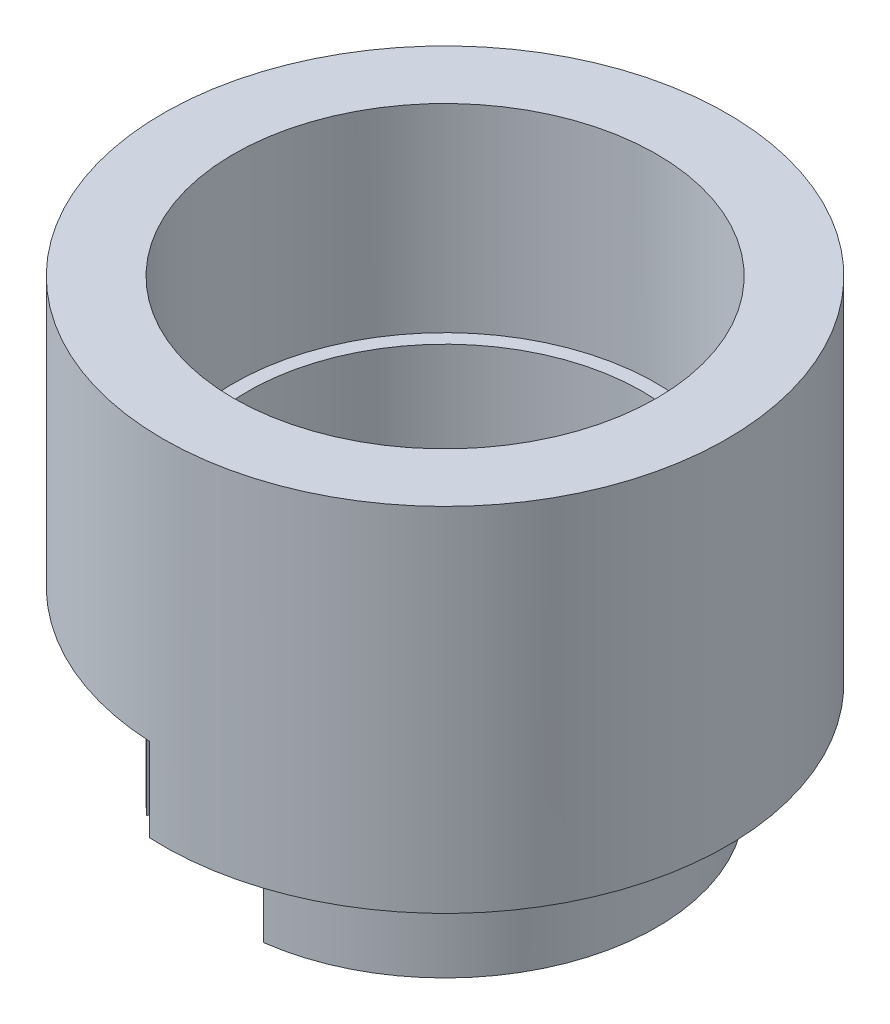
ISO-10303-21;
HEADER;
FILE_DESCRIPTION(('STEP AP214'),'2;1');
FILE_NAME('part.step','',(''),(''),'','','');
FILE_SCHEMA(('AUTOMOTIVE_DESIGN { 1 0 10303 214 1 1 1 1 }'));
ENDSEC;
DATA;
#1=APPLICATION_CONTEXT('core data for automotive mechanical design processes');
#2=APPLICATION_PROTOCOL_DEFINITION('international standard','automotive_design',2000,#1);
#3=PRODUCT_CONTEXT('',#1,'mechanical');
#4=PRODUCT('Part','Part','',(#3));
#5=PRODUCT_RELATED_PRODUCT_CATEGORY('part','',(#4));
#6=PRODUCT_DEFINITION_FORMATION('','',#4);
#7=PRODUCT_DEFINITION_CONTEXT('part definition',#1,'design');
#8=PRODUCT_DEFINITION('design','',#6,#7);
#9=PRODUCT_DEFINITION_SHAPE('','',#8);
#10=(LENGTH_UNIT() NAMED_UNIT(*) SI_UNIT(.MILLI.,.METRE.));
#11=(NAMED_UNIT(*) PLANE_ANGLE_UNIT() SI_UNIT($,.RADIAN.));
#12=(NAMED_UNIT(*) SI_UNIT($,.STERADIAN.) SOLID_ANGLE_UNIT());
#13=UNCERTAINTY_MEASURE_WITH_UNIT(LENGTH_MEASURE(1.E-05),#10,'distance_accuracy_value','');
#14=(GEOMETRIC_REPRESENTATION_CONTEXT(3) GLOBAL_UNCERTAINTY_ASSIGNED_CONTEXT((#13)) GLOBAL_UNIT_ASSIGNED_CONTEXT((#10,
#11,#12)) REPRESENTATION_CONTEXT('',''));
#15=CARTESIAN_POINT('',(0.,0.,0.));
#16=DIRECTION('',(0.,0.,1.));
#17=DIRECTION('',(1.,0.,0.));
#18=AXIS2_PLACEMENT_3D('',#15,#16,#17);
#19=CARTESIAN_POINT('',(0.,0.,0.));
#20=DIRECTION('',(0.,1.,0.));
#21=DIRECTION('',(0.,0.,1.));
#22=AXIS2_PLACEMENT_3D('',#19,#20,#21);
#23=PLANE('',#22);
#24=CARTESIAN_POINT('',(-21.1602690825293,0.,-29.1246117974979));
#25=DIRECTION('',(0.,-1.,0.));
#26=DIRECTION('',(0.,0.,-1.));
#27=AXIS2_PLACEMENT_3D('',#24,#25,#26);
#28=CIRCLE('',#27,1.5);
#29=CARTESIAN_POINT('',(-21.1602690825293,0.,-30.6246117974979));
#30=VERTEX_POINT('',#29);
#31=EDGE_CURVE('E253',#30,#30,#28,.T.);
#32=ORIENTED_EDGE('',*,*,#31,.F.);
#33=EDGE_LOOP('',(#32));
#34=FACE_BOUND('',#33,.T.);
#35=CARTESIAN_POINT('',(-34.2380345866256,0.,-11.1246117974978));
#36=DIRECTION('',(0.,-1.,0.));
#37=DIRECTION('',(0.,0.,-1.));
#38=AXIS2_PLACEMENT_3D('',#35,#36,#37);
#39=CIRCLE('',#38,1.5);
#40=CARTESIAN_POINT('',(-34.2380345866256,0.,-12.6246117974978));
#41=VERTEX_POINT('',#40);
#42=EDGE_CURVE('E236',#41,#41,#39,.T.);
#43=ORIENTED_EDGE('',*,*,#42,.F.);
#44=EDGE_LOOP('',(#43));
#45=FACE_BOUND('',#44,.T.);
#46=CARTESIAN_POINT('',(-34.2380345866254,0.,11.1246117974985));
#47=DIRECTION('',(0.,-1.,0.));
#48=DIRECTION('',(0.,0.,-1.));
#49=AXIS2_PLACEMENT_3D('',#46,#47,#48);
#50=CIRCLE('',#49,1.5);
#51=CARTESIAN_POINT('',(-34.2380345866254,0.,9.62461179749849));
#52=VERTEX_POINT('',#51);
#53=EDGE_CURVE('E207',#52,#52,#50,.T.);
#54=ORIENTED_EDGE('',*,*,#53,.F.);
#55=EDGE_LOOP('',(#54));
#56=FACE_BOUND('',#55,.T.);
#57=DIRECTION('',(-0.819178042205052,0.,0.573539305688021));
#58=VECTOR('',#57,1.);
#59=CARTESIAN_POINT('',(-3.81627640035369,0.,-5.45073336587605));
#60=LINE('',#59,#58);
#61=CARTESIAN_POINT('',(-30.2939246678071,0.,13.0873270082637));
#62=VERTEX_POINT('',#61);
#63=CARTESIAN_POINT('',(-36.126859333869,0.,17.1711978228324));
#64=VERTEX_POINT('',#63);
#65=EDGE_CURVE('E172',#62,#64,#60,.T.);
#66=ORIENTED_EDGE('',*,*,#65,.T.);
#67=CARTESIAN_POINT('',(0.,0.,0.));
#68=DIRECTION('',(0.,1.,0.));
#69=DIRECTION('',(0.,0.,1.));
#70=AXIS2_PLACEMENT_3D('',#67,#68,#69);
#71=CIRCLE('',#70,40.);
#72=CARTESIAN_POINT('',(-19.5058879135128,0.,-34.9216313580204));
#73=VERTEX_POINT('',#72);
#74=EDGE_CURVE('E42',#73,#64,#71,.T.);
#75=ORIENTED_EDGE('',*,*,#74,.F.);
#76=DIRECTION('',(-0.487647197837817,0.,-0.873040783950512));
#77=VECTOR('',#76,1.);
#78=CARTESIAN_POINT('',(-1.40847043936586E-13,0.,0.));
#79=LINE('',#78,#77);
#80=CARTESIAN_POINT('',(-16.0923575286481,0.,-28.8103458703668));
#81=VERTEX_POINT('',#80);
#82=EDGE_CURVE('E199',#81,#73,#79,.T.);
#83=ORIENTED_EDGE('',*,*,#82,.F.);
#84=CARTESIAN_POINT('',(0.,0.,0.));
#85=DIRECTION('',(0.,-1.,0.));
#86=DIRECTION('',(0.,0.,-1.));
#87=AXIS2_PLACEMENT_3D('',#84,#85,#86);
#88=CIRCLE('',#87,33.);
#89=EDGE_CURVE('E196',#62,#81,#88,.T.);
#90=ORIENTED_EDGE('',*,*,#89,.F.);
#91=EDGE_LOOP('',(#66,#75,#83,#90));
#92=FACE_BOUND('',#91,.T.);
#93=ADVANCED_FACE('F33',(#34,#45,#56,#92),#23,.F.);
#94=CARTESIAN_POINT('',(0.,50.,0.));
#95=DIRECTION('',(0.,-1.,0.));
#96=DIRECTION('',(0.,0.,-1.));
#97=AXIS2_PLACEMENT_3D('',#94,#95,#96);
#98=CYLINDRICAL_SURFACE('',#97,40.);
#99=CARTESIAN_POINT('',(0.,50.,0.));
#100=DIRECTION('',(0.,1.,0.));
#101=DIRECTION('',(0.,0.,1.));
#102=AXIS2_PLACEMENT_3D('',#99,#100,#101);
#103=CIRCLE('',#102,40.);
#104=CARTESIAN_POINT('',(0.,50.,40.));
#105=VERTEX_POINT('',#104);
#106=EDGE_CURVE('E11',#105,#105,#103,.T.);
#107=ORIENTED_EDGE('',*,*,#106,.F.);
#108=EDGE_LOOP('',(#107));
#109=FACE_BOUND('',#108,.T.);
#110=DIRECTION('',(0.,-1.,0.));
#111=VECTOR('',#110,1.);
#112=CARTESIAN_POINT('',(-36.126859333869,11.84997677,17.1711978228324));
#113=LINE('',#112,#111);
#114=CARTESIAN_POINT('',(-36.126859333869,11.84997677,17.1711978228324));
#115=VERTEX_POINT('',#114);
#116=EDGE_CURVE('E205',#115,#64,#113,.T.);
#117=ORIENTED_EDGE('',*,*,#116,.F.);
#118=CARTESIAN_POINT('',(0.,11.84997677,0.));
#119=DIRECTION('',(0.,-1.,0.));
#120=DIRECTION('',(0.,0.,-1.));
#121=AXIS2_PLACEMENT_3D('',#118,#119,#120);
#122=CIRCLE('',#121,40.);
#123=CARTESIAN_POINT('',(-1.9505371321681,11.84997677,39.9524142561627));
#124=VERTEX_POINT('',#123);
#125=EDGE_CURVE('E186',#124,#115,#122,.T.);
#126=ORIENTED_EDGE('',*,*,#125,.F.);
#127=DIRECTION('',(0.,-1.,0.));
#128=VECTOR('',#127,1.);
#129=CARTESIAN_POINT('',(-1.9505371321681,11.84997677,39.9524142561627));
#130=LINE('',#129,#128);
#131=CARTESIAN_POINT('',(-1.9505371321681,0.,39.9524142561627));
#132=VERTEX_POINT('',#131);
#133=EDGE_CURVE('E208',#124,#132,#130,.T.);
#134=ORIENTED_EDGE('',*,*,#133,.T.);
#135=CARTESIAN_POINT('',(4.19737007297038,0.,-39.7791664627419));
#136=VERTEX_POINT('',#135);
#137=EDGE_CURVE('E37',#132,#136,#71,.T.);
#138=ORIENTED_EDGE('',*,*,#137,.T.);
#139=DIRECTION('',(0.,-1.,0.));
#140=VECTOR('',#139,1.);
#141=CARTESIAN_POINT('',(4.19737007297038,11.84997677,-39.7791664627419));
#142=LINE('',#141,#140);
#143=CARTESIAN_POINT('',(4.19737007297038,11.84997677,-39.7791664627419));
#144=VERTEX_POINT('',#143);
#145=EDGE_CURVE('E216',#144,#136,#142,.T.);
#146=ORIENTED_EDGE('',*,*,#145,.F.);
#147=CARTESIAN_POINT('',(-19.5058879135128,11.84997677,-34.9216313580204));
#148=VERTEX_POINT('',#147);
#149=EDGE_CURVE('E182',#148,#144,#122,.T.);
#150=ORIENTED_EDGE('',*,*,#149,.F.);
#151=DIRECTION('',(0.,-1.,0.));
#152=VECTOR('',#151,1.);
#153=CARTESIAN_POINT('',(-19.5058879135128,11.84997677,-34.9216313580204));
#154=LINE('',#153,#152);
#155=EDGE_CURVE('E218',#148,#73,#154,.T.);
#156=ORIENTED_EDGE('',*,*,#155,.T.);
#157=ORIENTED_EDGE('',*,*,#74,.T.);
#158=EDGE_LOOP('',(#117,#126,#134,#138,#146,#150,#156,#157));
#159=FACE_BOUND('',#158,.T.);
#160=ADVANCED_FACE('F35',(#109,#159),#98,.T.);
#161=CARTESIAN_POINT('',(0.,50.,0.));
#162=DIRECTION('',(0.,1.,0.));
#163=DIRECTION('',(0.,0.,1.));
#164=AXIS2_PLACEMENT_3D('',#161,#162,#163);
#165=PLANE('',#164);
#166=ORIENTED_EDGE('',*,*,#106,.T.);
#167=EDGE_LOOP('',(#166));
#168=FACE_BOUND('',#167,.T.);
#169=CARTESIAN_POINT('',(0.,50.,0.));
#170=DIRECTION('',(0.,1.,0.));
#171=DIRECTION('',(0.,0.,1.));
#172=AXIS2_PLACEMENT_3D('',#169,#170,#171);
#173=CIRCLE('',#172,30.);
#174=CARTESIAN_POINT('',(0.,50.,30.));
#175=VERTEX_POINT('',#174);
#176=EDGE_CURVE('E261',#175,#175,#173,.T.);
#177=ORIENTED_EDGE('',*,*,#176,.F.);
#178=EDGE_LOOP('',(#177));
#179=FACE_BOUND('',#178,.T.);
#180=ADVANCED_FACE('F296',(#168,#179),#165,.T.);
#181=CARTESIAN_POINT('',(21.1602690825291,0.,29.1246117974981));
#182=DIRECTION('',(0.,-1.,0.));
#183=DIRECTION('',(0.,0.,-1.));
#184=AXIS2_PLACEMENT_3D('',#181,#182,#183);
#185=CIRCLE('',#184,1.5);
#186=CARTESIAN_POINT('',(21.1602690825291,0.,27.6246117974981));
#187=VERTEX_POINT('',#186);
#188=EDGE_CURVE('E229',#187,#187,#185,.T.);
#189=ORIENTED_EDGE('',*,*,#188,.F.);
#190=EDGE_LOOP('',(#189));
#191=FACE_BOUND('',#190,.T.);
#192=CARTESIAN_POINT('',(34.2380345866255,0.,-11.1246117974983));
#193=DIRECTION('',(0.,-1.,0.));
#194=DIRECTION('',(0.,0.,-1.));
#195=AXIS2_PLACEMENT_3D('',#192,#193,#194);
#196=CIRCLE('',#195,1.5);
#197=CARTESIAN_POINT('',(34.2380345866255,0.,-12.6246117974983));
#198=VERTEX_POINT('',#197);
#199=EDGE_CURVE('E247',#198,#198,#196,.T.);
#200=ORIENTED_EDGE('',*,*,#199,.F.);
#201=EDGE_LOOP('',(#200));
#202=FACE_BOUND('',#201,.T.);
#203=CARTESIAN_POINT('',(34.2380345866256,0.,11.124611797498));
#204=DIRECTION('',(0.,-1.,0.));
#205=DIRECTION('',(0.,0.,-1.));
#206=AXIS2_PLACEMENT_3D('',#203,#204,#205);
#207=CIRCLE('',#206,1.5);
#208=CARTESIAN_POINT('',(34.2380345866256,0.,9.62461179749802));
#209=VERTEX_POINT('',#208);
#210=EDGE_CURVE('E241',#209,#209,#207,.T.);
#211=ORIENTED_EDGE('',*,*,#210,.F.);
#212=EDGE_LOOP('',(#211));
#213=FACE_BOUND('',#212,.T.);
#214=ORIENTED_EDGE('',*,*,#137,.F.);
#215=DIRECTION('',(-0.0487634283041756,0.,0.998810356404069));
#216=VECTOR('',#215,1.);
#217=CARTESIAN_POINT('',(-1.07793096146607E-12,0.,0.));
#218=LINE('',#217,#216);
#219=CARTESIAN_POINT('',(-1.46290284912635,0.,29.964310692122));
#220=VERTEX_POINT('',#219);
#221=EDGE_CURVE('E176',#220,#132,#218,.T.);
#222=ORIENTED_EDGE('',*,*,#221,.F.);
#223=CARTESIAN_POINT('',(0.,0.,0.));
#224=DIRECTION('',(0.,1.,0.));
#225=DIRECTION('',(0.,0.,1.));
#226=AXIS2_PLACEMENT_3D('',#223,#224,#225);
#227=CIRCLE('',#226,30.);
#228=CARTESIAN_POINT('',(4.00883862894171,0.,29.7309470560072));
#229=VERTEX_POINT('',#228);
#230=EDGE_CURVE('E228',#220,#229,#227,.T.);
#231=ORIENTED_EDGE('',*,*,#230,.T.);
#232=CARTESIAN_POINT('',(0.,0.,0.));
#233=DIRECTION('',(0.,1.,0.));
#234=DIRECTION('',(0.,0.,1.));
#235=AXIS2_PLACEMENT_3D('',#232,#233,#234);
#236=CIRCLE('',#235,30.);
#237=CARTESIAN_POINT('',(3.14802755472722,0.,-29.8343748470565));
#238=VERTEX_POINT('',#237);
#239=EDGE_CURVE('E166',#229,#238,#236,.T.);
#240=ORIENTED_EDGE('',*,*,#239,.T.);
#241=DIRECTION('',(0.104934251824316,0.,-0.994479161568542));
#242=VECTOR('',#241,1.);
#243=CARTESIAN_POINT('',(-2.26511715484874E-12,0.,-2.39007897926772E-13));
#244=LINE('',#243,#242);
#245=EDGE_CURVE('E201',#238,#136,#244,.T.);
#246=ORIENTED_EDGE('',*,*,#245,.T.);
#247=EDGE_LOOP('',(#214,#222,#231,#240,#246));
#248=FACE_BOUND('',#247,.T.);
#249=ADVANCED_FACE('F270',(#191,#202,#213,#248),#23,.F.);
#250=CARTESIAN_POINT('',(0.,50.,0.));
#251=DIRECTION('',(0.,-1.,0.));
#252=DIRECTION('',(0.,0.,-1.));
#253=AXIS2_PLACEMENT_3D('',#250,#251,#252);
#254=CYLINDRICAL_SURFACE('',#253,30.);
#255=DIRECTION('',(0.,-1.,0.));
#256=VECTOR('',#255,1.);
#257=CARTESIAN_POINT('',(4.0088386289417,21.84997677,29.7309470560072));
#258=LINE('',#257,#256);
#259=CARTESIAN_POINT('',(4.00883862894171,21.84997677,29.7309470560072));
#260=VERTEX_POINT('',#259);
#261=EDGE_CURVE('E167',#260,#229,#258,.T.);
#262=ORIENTED_EDGE('',*,*,#261,.T.);
#263=ORIENTED_EDGE('',*,*,#230,.F.);
#264=DIRECTION('',(0.,-1.,0.));
#265=VECTOR('',#264,1.);
#266=CARTESIAN_POINT('',(-1.46290284912635,11.84997677,29.964310692122));
#267=LINE('',#266,#265);
#268=CARTESIAN_POINT('',(-1.46290284912635,11.84997677,29.964310692122));
#269=VERTEX_POINT('',#268);
#270=EDGE_CURVE('E211',#269,#220,#267,.T.);
#271=ORIENTED_EDGE('',*,*,#270,.F.);
#272=CARTESIAN_POINT('',(0.,11.84997677,0.));
#273=DIRECTION('',(0.,-1.,0.));
#274=DIRECTION('',(0.,0.,-1.));
#275=AXIS2_PLACEMENT_3D('',#272,#273,#274);
#276=CIRCLE('',#275,30.);
#277=CARTESIAN_POINT('',(-19.9092408020485,11.84997677,22.441526924121));
#278=VERTEX_POINT('',#277);
#279=EDGE_CURVE('E189',#269,#278,#276,.T.);
#280=ORIENTED_EDGE('',*,*,#279,.T.);
#281=DIRECTION('',(0.,-1.,0.));
#282=VECTOR('',#281,1.);
#283=CARTESIAN_POINT('',(-19.9092408020485,21.84997677,22.441526924121));
#284=LINE('',#283,#282);
#285=CARTESIAN_POINT('',(-19.9092408020485,21.84997677,22.441526924121));
#286=VERTEX_POINT('',#285);
#287=EDGE_CURVE('E54',#286,#278,#284,.T.);
#288=ORIENTED_EDGE('',*,*,#287,.F.);
#289=CARTESIAN_POINT('',(0.,21.84997677,0.));
#290=DIRECTION('',(0.,-1.,0.));
#291=DIRECTION('',(0.,0.,-1.));
#292=AXIS2_PLACEMENT_3D('',#289,#290,#291);
#293=CIRCLE('',#292,30.);
#294=EDGE_CURVE('E49',#286,#260,#293,.T.);
#295=ORIENTED_EDGE('',*,*,#294,.T.);
#296=EDGE_LOOP('',(#262,#263,#271,#280,#288,#295));
#297=FACE_BOUND('',#296,.T.);
#298=ORIENTED_EDGE('',*,*,#176,.T.);
#299=EDGE_LOOP('',(#298));
#300=FACE_BOUND('',#299,.T.);
#301=ADVANCED_FACE('F302',(#297,#300),#254,.F.);
#302=CARTESIAN_POINT('',(34.2380345866256,10.,11.124611797498));
#303=DIRECTION('',(0.,-1.,0.));
#304=DIRECTION('',(0.,0.,-1.));
#305=AXIS2_PLACEMENT_3D('',#302,#303,#304);
#306=CYLINDRICAL_SURFACE('',#305,1.5);
#307=CARTESIAN_POINT('',(34.2380345866256,10.,11.124611797498));
#308=DIRECTION('',(0.,-1.,0.));
#309=DIRECTION('',(0.,0.,-1.));
#310=AXIS2_PLACEMENT_3D('',#307,#308,#309);
#311=CIRCLE('',#310,1.5);
#312=CARTESIAN_POINT('',(34.2380345866256,10.,9.62461179749802));
#313=VERTEX_POINT('',#312);
#314=EDGE_CURVE('E232',#313,#313,#311,.T.);
#315=ORIENTED_EDGE('',*,*,#314,.F.);
#316=EDGE_LOOP('',(#315));
#317=FACE_BOUND('',#316,.T.);
#318=ORIENTED_EDGE('',*,*,#210,.T.);
#319=EDGE_LOOP('',(#318));
#320=FACE_BOUND('',#319,.T.);
#321=ADVANCED_FACE('F308',(#317,#320),#306,.F.);
#322=CARTESIAN_POINT('',(34.2380345866256,10.,11.124611797498));
#323=DIRECTION('',(0.,-1.,0.));
#324=DIRECTION('',(0.,0.,-1.));
#325=AXIS2_PLACEMENT_3D('',#322,#323,#324);
#326=PLANE('',#325);
#327=ORIENTED_EDGE('',*,*,#314,.T.);
#328=EDGE_LOOP('',(#327));
#329=FACE_BOUND('',#328,.T.);
#330=ADVANCED_FACE('F318',(#329),#326,.T.);
#331=CARTESIAN_POINT('',(34.2380345866255,10.,-11.1246117974983));
#332=DIRECTION('',(0.,-1.,0.));
#333=DIRECTION('',(0.,0.,-1.));
#334=AXIS2_PLACEMENT_3D('',#331,#332,#333);
#335=CYLINDRICAL_SURFACE('',#334,1.5);
#336=CARTESIAN_POINT('',(34.2380345866255,10.,-11.1246117974983));
#337=DIRECTION('',(0.,-1.,0.));
#338=DIRECTION('',(0.,0.,-1.));
#339=AXIS2_PLACEMENT_3D('',#336,#337,#338);
#340=CIRCLE('',#339,1.5);
#341=CARTESIAN_POINT('',(34.2380345866255,10.,-12.6246117974983));
#342=VERTEX_POINT('',#341);
#343=EDGE_CURVE('E244',#342,#342,#340,.T.);
#344=ORIENTED_EDGE('',*,*,#343,.F.);
#345=EDGE_LOOP('',(#344));
#346=FACE_BOUND('',#345,.T.);
#347=ORIENTED_EDGE('',*,*,#199,.T.);
#348=EDGE_LOOP('',(#347));
#349=FACE_BOUND('',#348,.T.);
#350=ADVANCED_FACE('F324',(#346,#349),#335,.F.);
#351=CARTESIAN_POINT('',(34.2380345866255,10.,-11.1246117974983));
#352=DIRECTION('',(0.,-1.,0.));
#353=DIRECTION('',(0.,0.,-1.));
#354=AXIS2_PLACEMENT_3D('',#351,#352,#353);
#355=PLANE('',#354);
#356=ORIENTED_EDGE('',*,*,#343,.T.);
#357=EDGE_LOOP('',(#356));
#358=FACE_BOUND('',#357,.T.);
#359=ADVANCED_FACE('F330',(#358),#355,.T.);
#360=CARTESIAN_POINT('',(-21.1602690825293,10.,-29.1246117974979));
#361=DIRECTION('',(0.,-1.,0.));
#362=DIRECTION('',(0.,0.,-1.));
#363=AXIS2_PLACEMENT_3D('',#360,#361,#362);
#364=CYLINDRICAL_SURFACE('',#363,1.5);
#365=CARTESIAN_POINT('',(-21.1602690825293,10.,-29.1246117974979));
#366=DIRECTION('',(0.,-1.,0.));
#367=DIRECTION('',(0.,0.,-1.));
#368=AXIS2_PLACEMENT_3D('',#365,#366,#367);
#369=CIRCLE('',#368,1.5);
#370=CARTESIAN_POINT('',(-21.1602690825293,10.,-30.6246117974979));
#371=VERTEX_POINT('',#370);
#372=EDGE_CURVE('E250',#371,#371,#369,.T.);
#373=ORIENTED_EDGE('',*,*,#372,.F.);
#374=EDGE_LOOP('',(#373));
#375=FACE_BOUND('',#374,.T.);
#376=ORIENTED_EDGE('',*,*,#31,.T.);
#377=EDGE_LOOP('',(#376));
#378=FACE_BOUND('',#377,.T.);
#379=ADVANCED_FACE('F333',(#375,#378),#364,.F.);
#380=CARTESIAN_POINT('',(-21.1602690825293,10.,-29.1246117974979));
#381=DIRECTION('',(0.,-1.,0.));
#382=DIRECTION('',(0.,0.,-1.));
#383=AXIS2_PLACEMENT_3D('',#380,#381,#382);
#384=PLANE('',#383);
#385=ORIENTED_EDGE('',*,*,#372,.T.);
#386=EDGE_LOOP('',(#385));
#387=FACE_BOUND('',#386,.T.);
#388=ADVANCED_FACE('F338',(#387),#384,.T.);
#389=CARTESIAN_POINT('',(-34.2380345866256,10.,-11.1246117974978));
#390=DIRECTION('',(0.,-1.,0.));
#391=DIRECTION('',(0.,0.,-1.));
#392=AXIS2_PLACEMENT_3D('',#389,#390,#391);
#393=CYLINDRICAL_SURFACE('',#392,1.5);
#394=CARTESIAN_POINT('',(-34.2380345866256,10.,-11.1246117974978));
#395=DIRECTION('',(0.,-1.,0.));
#396=DIRECTION('',(0.,0.,-1.));
#397=AXIS2_PLACEMENT_3D('',#394,#395,#396);
#398=CIRCLE('',#397,1.5);
#399=CARTESIAN_POINT('',(-34.2380345866256,10.,-12.6246117974978));
#400=VERTEX_POINT('',#399);
#401=EDGE_CURVE('E256',#400,#400,#398,.T.);
#402=ORIENTED_EDGE('',*,*,#401,.F.);
#403=EDGE_LOOP('',(#402));
#404=FACE_BOUND('',#403,.T.);
#405=ORIENTED_EDGE('',*,*,#42,.T.);
#406=EDGE_LOOP('',(#405));
#407=FACE_BOUND('',#406,.T.);
#408=ADVANCED_FACE('F341',(#404,#407),#393,.F.);
#409=CARTESIAN_POINT('',(-34.2380345866256,10.,-11.1246117974978));
#410=DIRECTION('',(0.,-1.,0.));
#411=DIRECTION('',(0.,0.,-1.));
#412=AXIS2_PLACEMENT_3D('',#409,#410,#411);
#413=PLANE('',#412);
#414=ORIENTED_EDGE('',*,*,#401,.T.);
#415=EDGE_LOOP('',(#414));
#416=FACE_BOUND('',#415,.T.);
#417=ADVANCED_FACE('F346',(#416),#413,.T.);
#418=CARTESIAN_POINT('',(-34.2380345866254,10.,11.1246117974985));
#419=DIRECTION('',(0.,-1.,0.));
#420=DIRECTION('',(0.,0.,-1.));
#421=AXIS2_PLACEMENT_3D('',#418,#419,#420);
#422=CYLINDRICAL_SURFACE('',#421,1.5);
#423=CARTESIAN_POINT('',(-34.2380345866254,10.,11.1246117974985));
#424=DIRECTION('',(0.,-1.,0.));
#425=DIRECTION('',(0.,0.,-1.));
#426=AXIS2_PLACEMENT_3D('',#423,#424,#425);
#427=CIRCLE('',#426,1.5);
#428=CARTESIAN_POINT('',(-34.2380345866254,10.,9.62461179749849));
#429=VERTEX_POINT('',#428);
#430=EDGE_CURVE('E233',#429,#429,#427,.T.);
#431=ORIENTED_EDGE('',*,*,#430,.F.);
#432=EDGE_LOOP('',(#431));
#433=FACE_BOUND('',#432,.T.);
#434=ORIENTED_EDGE('',*,*,#53,.T.);
#435=EDGE_LOOP('',(#434));
#436=FACE_BOUND('',#435,.T.);
#437=ADVANCED_FACE('F349',(#433,#436),#422,.F.);
#438=CARTESIAN_POINT('',(-34.2380345866254,10.,11.1246117974985));
#439=DIRECTION('',(0.,-1.,0.));
#440=DIRECTION('',(0.,0.,-1.));
#441=AXIS2_PLACEMENT_3D('',#438,#439,#440);
#442=PLANE('',#441);
#443=ORIENTED_EDGE('',*,*,#430,.T.);
#444=EDGE_LOOP('',(#443));
#445=FACE_BOUND('',#444,.T.);
#446=ADVANCED_FACE('F415',(#445),#442,.T.);
#447=CARTESIAN_POINT('',(21.1602690825291,10.,29.1246117974981));
#448=DIRECTION('',(0.,-1.,0.));
#449=DIRECTION('',(0.,0.,-1.));
#450=AXIS2_PLACEMENT_3D('',#447,#448,#449);
#451=CYLINDRICAL_SURFACE('',#450,1.5);
#452=CARTESIAN_POINT('',(21.1602690825291,10.,29.1246117974981));
#453=DIRECTION('',(0.,-1.,0.));
#454=DIRECTION('',(0.,0.,-1.));
#455=AXIS2_PLACEMENT_3D('',#452,#453,#454);
#456=CIRCLE('',#455,1.5);
#457=CARTESIAN_POINT('',(21.1602690825291,10.,27.6246117974981));
#458=VERTEX_POINT('',#457);
#459=EDGE_CURVE('E225',#458,#458,#456,.T.);
#460=ORIENTED_EDGE('',*,*,#459,.F.);
#461=EDGE_LOOP('',(#460));
#462=FACE_BOUND('',#461,.T.);
#463=ORIENTED_EDGE('',*,*,#188,.T.);
#464=EDGE_LOOP('',(#463));
#465=FACE_BOUND('',#464,.T.);
#466=ADVANCED_FACE('F411',(#462,#465),#451,.F.);
#467=CARTESIAN_POINT('',(21.1602690825291,10.,29.1246117974981));
#468=DIRECTION('',(0.,-1.,0.));
#469=DIRECTION('',(0.,0.,-1.));
#470=AXIS2_PLACEMENT_3D('',#467,#468,#469);
#471=PLANE('',#470);
#472=ORIENTED_EDGE('',*,*,#459,.T.);
#473=EDGE_LOOP('',(#472));
#474=FACE_BOUND('',#473,.T.);
#475=ADVANCED_FACE('F400',(#474),#471,.T.);
#476=CARTESIAN_POINT('',(-3.81627640035369,11.84997677,-5.45073336587605));
#477=DIRECTION('',(0.573539305688021,0.,0.819178042205052));
#478=DIRECTION('',(0.819178042205053,0.,-0.573539305688021));
#479=AXIS2_PLACEMENT_3D('',#476,#477,#478);
#480=PLANE('',#479);
#481=ORIENTED_EDGE('',*,*,#65,.F.);
#482=DIRECTION('',(0.,-1.,0.));
#483=VECTOR('',#482,1.);
#484=CARTESIAN_POINT('',(-30.2939246678071,11.84997677,13.0873270082637));
#485=LINE('',#484,#483);
#486=CARTESIAN_POINT('',(-30.2939246678071,11.84997677,13.0873270082637));
#487=VERTEX_POINT('',#486);
#488=EDGE_CURVE('E223',#487,#62,#485,.T.);
#489=ORIENTED_EDGE('',*,*,#488,.F.);
#490=DIRECTION('',(-0.819178042205052,0.,0.573539305688021));
#491=VECTOR('',#490,1.);
#492=CARTESIAN_POINT('',(-3.81627640035369,11.84997677,-5.45073336587605));
#493=LINE('',#492,#491);
#494=EDGE_CURVE('E173',#487,#115,#493,.T.);
#495=ORIENTED_EDGE('',*,*,#494,.T.);
#496=ORIENTED_EDGE('',*,*,#116,.T.);
#497=EDGE_LOOP('',(#481,#489,#495,#496));
#498=FACE_BOUND('',#497,.T.);
#499=ADVANCED_FACE('F385',(#498),#480,.T.);
#500=CARTESIAN_POINT('',(-1.07793096146607E-12,11.84997677,0.));
#501=DIRECTION('',(0.998810356404069,0.,0.0487634283041756));
#502=DIRECTION('',(0.0487634283041756,0.,-0.998810356404069));
#503=AXIS2_PLACEMENT_3D('',#500,#501,#502);
#504=PLANE('',#503);
#505=ORIENTED_EDGE('',*,*,#221,.T.);
#506=ORIENTED_EDGE('',*,*,#133,.F.);
#507=DIRECTION('',(-0.0487634283041756,0.,0.998810356404069));
#508=VECTOR('',#507,1.);
#509=CARTESIAN_POINT('',(-1.07793096146607E-12,11.84997677,0.));
#510=LINE('',#509,#508);
#511=EDGE_CURVE('E191',#269,#124,#510,.T.);
#512=ORIENTED_EDGE('',*,*,#511,.F.);
#513=ORIENTED_EDGE('',*,*,#270,.T.);
#514=EDGE_LOOP('',(#505,#506,#512,#513));
#515=FACE_BOUND('',#514,.T.);
#516=ADVANCED_FACE('F389',(#515),#504,.F.);
#517=CARTESIAN_POINT('',(-2.26511715484874E-12,11.84997677,-2.39007897926772E-13));
#518=DIRECTION('',(-0.994479161568543,0.,-0.104934251824316));
#519=DIRECTION('',(-0.104934251824316,0.,0.994479161568543));
#520=AXIS2_PLACEMENT_3D('',#517,#518,#519);
#521=PLANE('',#520);
#522=ORIENTED_EDGE('',*,*,#245,.F.);
#523=DIRECTION('',(0.,-1.,0.));
#524=VECTOR('',#523,1.);
#525=CARTESIAN_POINT('',(3.14802755472722,11.84997677,-29.8343748470565));
#526=LINE('',#525,#524);
#527=CARTESIAN_POINT('',(3.14802755472722,11.84997677,-29.8343748470565));
#528=VERTEX_POINT('',#527);
#529=EDGE_CURVE('E213',#528,#238,#526,.T.);
#530=ORIENTED_EDGE('',*,*,#529,.F.);
#531=DIRECTION('',(0.104934251824316,0.,-0.994479161568542));
#532=VECTOR('',#531,1.);
#533=CARTESIAN_POINT('',(-2.26511715484874E-12,11.84997677,-2.39007897926772E-13));
#534=LINE('',#533,#532);
#535=EDGE_CURVE('E185',#528,#144,#534,.T.);
#536=ORIENTED_EDGE('',*,*,#535,.T.);
#537=ORIENTED_EDGE('',*,*,#145,.T.);
#538=EDGE_LOOP('',(#522,#530,#536,#537));
#539=FACE_BOUND('',#538,.T.);
#540=ADVANCED_FACE('F374',(#539),#521,.T.);
#541=CARTESIAN_POINT('',(-1.40847043936586E-13,11.84997677,0.));
#542=DIRECTION('',(-0.873040783950512,0.,0.487647197837817));
#543=DIRECTION('',(0.487647197837817,0.,0.873040783950512));
#544=AXIS2_PLACEMENT_3D('',#541,#542,#543);
#545=PLANE('',#544);
#546=ORIENTED_EDGE('',*,*,#82,.T.);
#547=ORIENTED_EDGE('',*,*,#155,.F.);
#548=DIRECTION('',(-0.487647197837817,0.,-0.873040783950512));
#549=VECTOR('',#548,1.);
#550=CARTESIAN_POINT('',(-1.40847043936586E-13,11.84997677,0.));
#551=LINE('',#550,#549);
#552=CARTESIAN_POINT('',(-16.0923575286481,11.84997677,-28.8103458703668));
#553=VERTEX_POINT('',#552);
#554=EDGE_CURVE('E179',#553,#148,#551,.T.);
#555=ORIENTED_EDGE('',*,*,#554,.F.);
#556=DIRECTION('',(0.,-1.,0.));
#557=VECTOR('',#556,1.);
#558=CARTESIAN_POINT('',(-16.0923575286481,11.84997677,-28.8103458703668));
#559=LINE('',#558,#557);
#560=EDGE_CURVE('E221',#553,#81,#559,.T.);
#561=ORIENTED_EDGE('',*,*,#560,.T.);
#562=EDGE_LOOP('',(#546,#547,#555,#561));
#563=FACE_BOUND('',#562,.T.);
#564=ADVANCED_FACE('F382',(#563),#545,.F.);
#565=CARTESIAN_POINT('',(0.,11.84997677,0.));
#566=DIRECTION('',(0.,-1.,0.));
#567=DIRECTION('',(0.,0.,-1.));
#568=AXIS2_PLACEMENT_3D('',#565,#566,#567);
#569=CYLINDRICAL_SURFACE('',#568,33.);
#570=ORIENTED_EDGE('',*,*,#89,.T.);
#571=ORIENTED_EDGE('',*,*,#560,.F.);
#572=CARTESIAN_POINT('',(0.,11.84997677,0.));
#573=DIRECTION('',(0.,-1.,0.));
#574=DIRECTION('',(0.,0.,-1.));
#575=AXIS2_PLACEMENT_3D('',#572,#573,#574);
#576=CIRCLE('',#575,33.);
#577=EDGE_CURVE('E175',#487,#553,#576,.T.);
#578=ORIENTED_EDGE('',*,*,#577,.F.);
#579=ORIENTED_EDGE('',*,*,#488,.T.);
#580=EDGE_LOOP('',(#570,#571,#578,#579));
#581=FACE_BOUND('',#580,.T.);
#582=ADVANCED_FACE('F384',(#581),#569,.F.);
#583=CARTESIAN_POINT('',(0.,11.84997677,0.));
#584=DIRECTION('',(0.,-1.,0.));
#585=DIRECTION('',(0.,0.,-1.));
#586=AXIS2_PLACEMENT_3D('',#583,#584,#585);
#587=PLANE('',#586);
#588=ORIENTED_EDGE('',*,*,#494,.F.);
#589=ORIENTED_EDGE('',*,*,#577,.T.);
#590=ORIENTED_EDGE('',*,*,#554,.T.);
#591=ORIENTED_EDGE('',*,*,#149,.T.);
#592=ORIENTED_EDGE('',*,*,#535,.F.);
#593=EDGE_CURVE('E188',#278,#528,#276,.T.);
#594=ORIENTED_EDGE('',*,*,#593,.F.);
#595=ORIENTED_EDGE('',*,*,#279,.F.);
#596=ORIENTED_EDGE('',*,*,#511,.T.);
#597=ORIENTED_EDGE('',*,*,#125,.T.);
#598=EDGE_LOOP('',(#588,#589,#590,#591,#592,#594,#595,#596,#597));
#599=FACE_BOUND('',#598,.T.);
#600=ADVANCED_FACE('F378',(#599),#587,.T.);
#601=CARTESIAN_POINT('',(0.,21.84997677,0.));
#602=DIRECTION('',(0.,-1.,0.));
#603=DIRECTION('',(0.,0.,-1.));
#604=AXIS2_PLACEMENT_3D('',#601,#602,#603);
#605=CYLINDRICAL_SURFACE('',#604,30.);
#606=ORIENTED_EDGE('',*,*,#239,.F.);
#607=CARTESIAN_POINT('',(4.0088386289417,-15.,29.7309470560072));
#608=VERTEX_POINT('',#607);
#609=EDGE_CURVE('E169',#229,#608,#258,.T.);
#610=ORIENTED_EDGE('',*,*,#609,.T.);
#611=CARTESIAN_POINT('',(0.,-15.,0.));
#612=DIRECTION('',(0.,-1.,0.));
#613=DIRECTION('',(0.,0.,-1.));
#614=AXIS2_PLACEMENT_3D('',#611,#612,#613);
#615=CIRCLE('',#614,30.);
#616=CARTESIAN_POINT('',(-19.9092408020485,-15.,22.441526924121));
#617=VERTEX_POINT('',#616);
#618=EDGE_CURVE('E148',#617,#608,#615,.T.);
#619=ORIENTED_EDGE('',*,*,#618,.F.);
#620=EDGE_CURVE('E138',#278,#617,#284,.T.);
#621=ORIENTED_EDGE('',*,*,#620,.F.);
#622=ORIENTED_EDGE('',*,*,#593,.T.);
#623=ORIENTED_EDGE('',*,*,#529,.T.);
#624=EDGE_LOOP('',(#606,#610,#619,#621,#622,#623));
#625=FACE_BOUND('',#624,.T.);
#626=ADVANCED_FACE('F275',(#625),#605,.T.);
#627=CARTESIAN_POINT('',(0.,21.84997677,0.));
#628=DIRECTION('',(0.,-1.,0.));
#629=DIRECTION('',(0.,0.,-1.));
#630=AXIS2_PLACEMENT_3D('',#627,#628,#629);
#631=CYLINDRICAL_SURFACE('',#630,28.);
#632=DIRECTION('',(0.,-1.,0.));
#633=VECTOR('',#632,1.);
#634=CARTESIAN_POINT('',(-19.230258498937,21.84997677,20.3518342678016));
#635=LINE('',#634,#633);
#636=CARTESIAN_POINT('',(-19.230258498937,21.84997677,20.3518342678016));
#637=VERTEX_POINT('',#636);
#638=CARTESIAN_POINT('',(-19.230258498937,-15.,20.3518342678016));
#639=VERTEX_POINT('',#638);
#640=EDGE_CURVE('E128',#637,#639,#635,.T.);
#641=ORIENTED_EDGE('',*,*,#640,.T.);
#642=CARTESIAN_POINT('',(0.,-15.,0.));
#643=DIRECTION('',(0.,1.,0.));
#644=DIRECTION('',(0.,0.,-1.));
#645=AXIS2_PLACEMENT_3D('',#642,#643,#644);
#646=CIRCLE('',#645,28.);
#647=CARTESIAN_POINT('',(4.70036246264258,-15.,27.602655537462));
#648=VERTEX_POINT('',#647);
#649=EDGE_CURVE('E132',#648,#639,#646,.T.);
#650=ORIENTED_EDGE('',*,*,#649,.F.);
#651=DIRECTION('',(0.,-1.,0.));
#652=VECTOR('',#651,1.);
#653=CARTESIAN_POINT('',(4.70036246264258,21.84997677,27.602655537462));
#654=LINE('',#653,#652);
#655=CARTESIAN_POINT('',(4.70036246264258,21.84997677,27.602655537462));
#656=VERTEX_POINT('',#655);
#657=EDGE_CURVE('E164',#656,#648,#654,.T.);
#658=ORIENTED_EDGE('',*,*,#657,.F.);
#659=CARTESIAN_POINT('',(0.,21.84997677,0.));
#660=DIRECTION('',(0.,1.,0.));
#661=DIRECTION('',(0.,0.,-1.));
#662=AXIS2_PLACEMENT_3D('',#659,#660,#661);
#663=CIRCLE('',#662,28.);
#664=EDGE_CURVE('E134',#656,#637,#663,.T.);
#665=ORIENTED_EDGE('',*,*,#664,.T.);
#666=EDGE_LOOP('',(#641,#650,#658,#665));
#667=FACE_BOUND('',#666,.T.);
#668=ADVANCED_FACE('F130',(#667),#631,.F.);
#669=CARTESIAN_POINT('',(4.00883862894171,21.84997677,29.7309470560072));
#670=DIRECTION('',(-0.951056516295143,0.,-0.309016994374979));
#671=DIRECTION('',(-0.309016994374979,0.,0.951056516295143));
#672=AXIS2_PLACEMENT_3D('',#669,#670,#671);
#673=PLANE('',#672);
#674=ORIENTED_EDGE('',*,*,#657,.T.);
#675=DIRECTION('',(0.309016994374979,0.,-0.951056516295143));
#676=VECTOR('',#675,1.);
#677=CARTESIAN_POINT('',(4.00883862894171,-15.,29.7309470560072));
#678=LINE('',#677,#676);
#679=EDGE_CURVE('E153',#608,#648,#678,.T.);
#680=ORIENTED_EDGE('',*,*,#679,.F.);
#681=ORIENTED_EDGE('',*,*,#609,.F.);
#682=ORIENTED_EDGE('',*,*,#261,.F.);
#683=DIRECTION('',(0.309016994374979,0.,-0.951056516295143));
#684=VECTOR('',#683,1.);
#685=CARTESIAN_POINT('',(4.00883862894171,21.84997677,29.7309470560072));
#686=LINE('',#685,#684);
#687=EDGE_CURVE('E139',#260,#656,#686,.T.);
#688=ORIENTED_EDGE('',*,*,#687,.T.);
#689=EDGE_LOOP('',(#674,#680,#681,#682,#688));
#690=FACE_BOUND('',#689,.T.);
#691=ADVANCED_FACE('F278',(#690),#673,.T.);
#692=CARTESIAN_POINT('',(-19.9092408020485,21.84997677,22.441526924121));
#693=DIRECTION('',(0.951056516295143,0.,0.309016994374979));
#694=DIRECTION('',(0.309016994374979,0.,-0.951056516295143));
#695=AXIS2_PLACEMENT_3D('',#692,#693,#694);
#696=PLANE('',#695);
#697=ORIENTED_EDGE('',*,*,#287,.T.);
#698=ORIENTED_EDGE('',*,*,#620,.T.);
#699=DIRECTION('',(-0.309016994374979,0.,0.951056516295143));
#700=VECTOR('',#699,1.);
#701=CARTESIAN_POINT('',(-19.9092408020485,-15.,22.441526924121));
#702=LINE('',#701,#700);
#703=EDGE_CURVE('E142',#639,#617,#702,.T.);
#704=ORIENTED_EDGE('',*,*,#703,.F.);
#705=ORIENTED_EDGE('',*,*,#640,.F.);
#706=DIRECTION('',(-0.309016994374979,0.,0.951056516295143));
#707=VECTOR('',#706,1.);
#708=CARTESIAN_POINT('',(-19.9092408020485,21.84997677,22.441526924121));
#709=LINE('',#708,#707);
#710=EDGE_CURVE('E159',#637,#286,#709,.T.);
#711=ORIENTED_EDGE('',*,*,#710,.T.);
#712=EDGE_LOOP('',(#697,#698,#704,#705,#711));
#713=FACE_BOUND('',#712,.T.);
#714=ADVANCED_FACE('F143',(#713),#696,.T.);
#715=CARTESIAN_POINT('',(0.,21.84997677,0.));
#716=DIRECTION('',(0.,-1.,0.));
#717=DIRECTION('',(0.,0.,-1.));
#718=AXIS2_PLACEMENT_3D('',#715,#716,#717);
#719=PLANE('',#718);
#720=ORIENTED_EDGE('',*,*,#664,.F.);
#721=ORIENTED_EDGE('',*,*,#687,.F.);
#722=ORIENTED_EDGE('',*,*,#294,.F.);
#723=ORIENTED_EDGE('',*,*,#710,.F.);
#724=EDGE_LOOP('',(#720,#721,#722,#723));
#725=FACE_BOUND('',#724,.T.);
#726=ADVANCED_FACE('F281',(#725),#719,.F.);
#727=CARTESIAN_POINT('',(0.,-15.,0.));
#728=DIRECTION('',(0.,-1.,0.));
#729=DIRECTION('',(0.,0.,-1.));
#730=AXIS2_PLACEMENT_3D('',#727,#728,#729);
#731=PLANE('',#730);
#732=ORIENTED_EDGE('',*,*,#649,.T.);
#733=ORIENTED_EDGE('',*,*,#703,.T.);
#734=ORIENTED_EDGE('',*,*,#618,.T.);
#735=ORIENTED_EDGE('',*,*,#679,.T.);
#736=EDGE_LOOP('',(#732,#733,#734,#735));
#737=FACE_BOUND('',#736,.T.);
#738=ADVANCED_FACE('F151',(#737),#731,.T.);
#739=CLOSED_SHELL('',(#93,#160,#180,#249,#301,#321,#330,#350,#359,#379,#388,#408,#417,#437,#446,
#466,#475,#499,#516,#540,#564,#582,#600,#626,#668,#691,#714,#726,#738));
#740=MANIFOLD_SOLID_BREP('B2',#739);
#741=ADVANCED_BREP_SHAPE_REPRESENTATION('',(#18,#740),#14);
#742=SHAPE_DEFINITION_REPRESENTATION(#9,#741);
ENDSEC;
END-ISO-10303-21;
